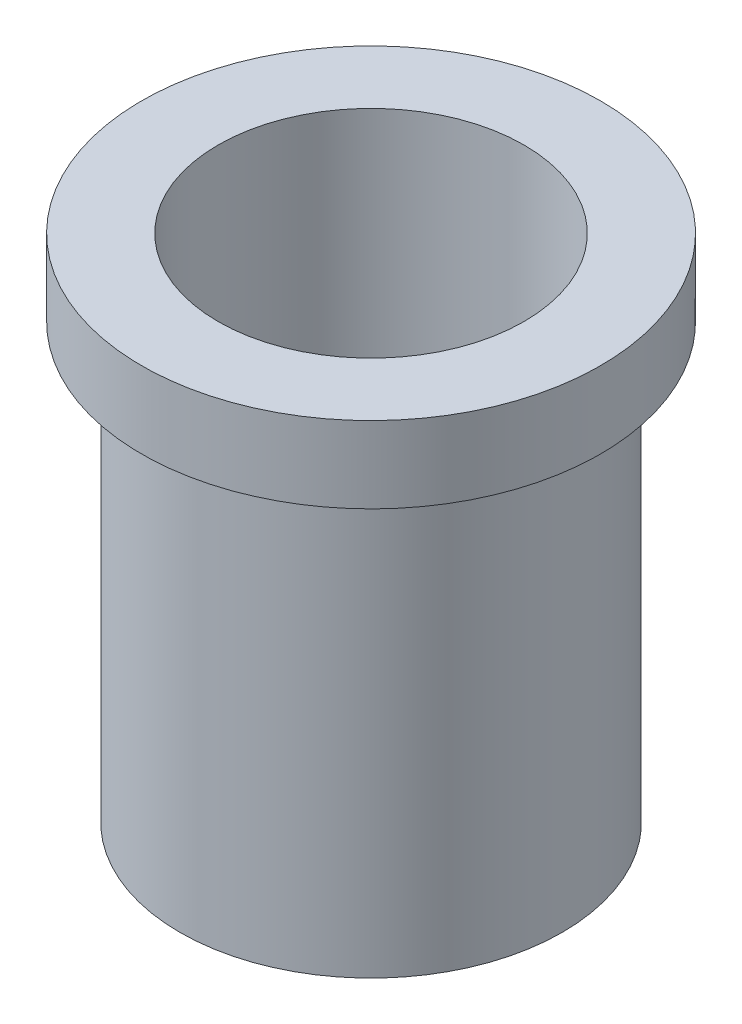
ISO-10303-21;
HEADER;
FILE_DESCRIPTION(('STEP AP214'),'2;1');
FILE_NAME('part.step','',(''),(''),'','','');
FILE_SCHEMA(('AUTOMOTIVE_DESIGN { 1 0 10303 214 1 1 1 1 }'));
ENDSEC;
DATA;
#1=APPLICATION_CONTEXT('core data for automotive mechanical design processes');
#2=APPLICATION_PROTOCOL_DEFINITION('international standard','automotive_design',2000,#1);
#3=PRODUCT_CONTEXT('',#1,'mechanical');
#4=PRODUCT('Part','Part','',(#3));
#5=PRODUCT_RELATED_PRODUCT_CATEGORY('part','',(#4));
#6=PRODUCT_DEFINITION_FORMATION('','',#4);
#7=PRODUCT_DEFINITION_CONTEXT('part definition',#1,'design');
#8=PRODUCT_DEFINITION('design','',#6,#7);
#9=PRODUCT_DEFINITION_SHAPE('','',#8);
#10=(LENGTH_UNIT() NAMED_UNIT(*) SI_UNIT(.MILLI.,.METRE.));
#11=(NAMED_UNIT(*) PLANE_ANGLE_UNIT() SI_UNIT($,.RADIAN.));
#12=(NAMED_UNIT(*) SI_UNIT($,.STERADIAN.) SOLID_ANGLE_UNIT());
#13=UNCERTAINTY_MEASURE_WITH_UNIT(LENGTH_MEASURE(1.E-05),#10,'distance_accuracy_value','');
#14=(GEOMETRIC_REPRESENTATION_CONTEXT(3) GLOBAL_UNCERTAINTY_ASSIGNED_CONTEXT((#13)) GLOBAL_UNIT_ASSIGNED_CONTEXT((#10,
#11,#12)) REPRESENTATION_CONTEXT('',''));
#15=CARTESIAN_POINT('',(0.,0.,0.));
#16=DIRECTION('',(0.,0.,1.));
#17=DIRECTION('',(1.,0.,0.));
#18=AXIS2_PLACEMENT_3D('',#15,#16,#17);
#19=CARTESIAN_POINT('',(49.,-12.,-49.));
#20=DIRECTION('',(0.,-1.,0.));
#21=DIRECTION('',(0.,0.,-1.));
#22=AXIS2_PLACEMENT_3D('',#19,#20,#21);
#23=PLANE('',#22);
#24=CARTESIAN_POINT('',(49.,-12.,-49.));
#25=DIRECTION('',(0.,-1.,0.));
#26=DIRECTION('',(0.,0.,-1.));
#27=AXIS2_PLACEMENT_3D('',#24,#25,#26);
#28=CIRCLE('',#27,9.);
#29=CARTESIAN_POINT('',(49.,-12.,-58.));
#30=VERTEX_POINT('',#29);
#31=EDGE_CURVE('E10',#30,#30,#28,.T.);
#32=ORIENTED_EDGE('',*,*,#31,.T.);
#33=EDGE_LOOP('',(#32));
#34=FACE_BOUND('',#33,.T.);
#35=CARTESIAN_POINT('',(49.,-12.,-49.));
#36=DIRECTION('',(0.,-1.,0.));
#37=DIRECTION('',(0.,0.,-1.));
#38=AXIS2_PLACEMENT_3D('',#35,#36,#37);
#39=CIRCLE('',#38,7.5);
#40=CARTESIAN_POINT('',(49.,-12.,-56.5));
#41=VERTEX_POINT('',#40);
#42=EDGE_CURVE('E48',#41,#41,#39,.T.);
#43=ORIENTED_EDGE('',*,*,#42,.F.);
#44=EDGE_LOOP('',(#43));
#45=FACE_BOUND('',#44,.T.);
#46=ADVANCED_FACE('F32',(#34,#45),#23,.T.);
#47=CARTESIAN_POINT('',(49.,-9.,-49.));
#48=DIRECTION('',(0.,-1.,0.));
#49=DIRECTION('',(0.,0.,-1.));
#50=AXIS2_PLACEMENT_3D('',#47,#48,#49);
#51=PLANE('',#50);
#52=CARTESIAN_POINT('',(49.,-9.,-49.));
#53=DIRECTION('',(0.,-1.,0.));
#54=DIRECTION('',(0.,0.,-1.));
#55=AXIS2_PLACEMENT_3D('',#52,#53,#54);
#56=CIRCLE('',#55,9.);
#57=CARTESIAN_POINT('',(49.,-9.,-58.));
#58=VERTEX_POINT('',#57);
#59=EDGE_CURVE('E36',#58,#58,#56,.T.);
#60=ORIENTED_EDGE('',*,*,#59,.F.);
#61=EDGE_LOOP('',(#60));
#62=FACE_BOUND('',#61,.T.);
#63=CARTESIAN_POINT('',(49.,-9.,-49.));
#64=DIRECTION('',(0.,-1.,0.));
#65=DIRECTION('',(0.,0.,-1.));
#66=AXIS2_PLACEMENT_3D('',#63,#64,#65);
#67=CIRCLE('',#66,6.);
#68=CARTESIAN_POINT('',(49.,-9.,-55.));
#69=VERTEX_POINT('',#68);
#70=EDGE_CURVE('E43',#69,#69,#67,.T.);
#71=ORIENTED_EDGE('',*,*,#70,.T.);
#72=EDGE_LOOP('',(#71));
#73=FACE_BOUND('',#72,.T.);
#74=ADVANCED_FACE('F73',(#62,#73),#51,.F.);
#75=CARTESIAN_POINT('',(49.,-12.,-49.));
#76=DIRECTION('',(0.,1.,0.));
#77=DIRECTION('',(0.,0.,1.));
#78=AXIS2_PLACEMENT_3D('',#75,#76,#77);
#79=CYLINDRICAL_SURFACE('',#78,9.);
#80=ORIENTED_EDGE('',*,*,#31,.F.);
#81=EDGE_LOOP('',(#80));
#82=FACE_BOUND('',#81,.T.);
#83=ORIENTED_EDGE('',*,*,#59,.T.);
#84=EDGE_LOOP('',(#83));
#85=FACE_BOUND('',#84,.T.);
#86=ADVANCED_FACE('F34',(#82,#85),#79,.T.);
#87=CARTESIAN_POINT('',(49.,-12.,-49.));
#88=DIRECTION('',(0.,1.,0.));
#89=DIRECTION('',(0.,0.,1.));
#90=AXIS2_PLACEMENT_3D('',#87,#88,#89);
#91=CYLINDRICAL_SURFACE('',#90,6.);
#92=ORIENTED_EDGE('',*,*,#70,.F.);
#93=EDGE_LOOP('',(#92));
#94=FACE_BOUND('',#93,.T.);
#95=CARTESIAN_POINT('',(49.,-29.,-49.));
#96=DIRECTION('',(0.,-1.,0.));
#97=DIRECTION('',(0.,0.,-1.));
#98=AXIS2_PLACEMENT_3D('',#95,#96,#97);
#99=CIRCLE('',#98,6.);
#100=CARTESIAN_POINT('',(49.,-29.,-55.));
#101=VERTEX_POINT('',#100);
#102=EDGE_CURVE('E51',#101,#101,#99,.T.);
#103=ORIENTED_EDGE('',*,*,#102,.T.);
#104=EDGE_LOOP('',(#103));
#105=FACE_BOUND('',#104,.T.);
#106=ADVANCED_FACE('F57',(#94,#105),#91,.F.);
#107=CARTESIAN_POINT('',(49.,-29.,-49.));
#108=DIRECTION('',(0.,-1.,0.));
#109=DIRECTION('',(0.,0.,-1.));
#110=AXIS2_PLACEMENT_3D('',#107,#108,#109);
#111=PLANE('',#110);
#112=CARTESIAN_POINT('',(49.,-29.,-49.));
#113=DIRECTION('',(0.,-1.,0.));
#114=DIRECTION('',(0.,0.,-1.));
#115=AXIS2_PLACEMENT_3D('',#112,#113,#114);
#116=CIRCLE('',#115,7.5);
#117=CARTESIAN_POINT('',(49.,-29.,-56.5));
#118=VERTEX_POINT('',#117);
#119=EDGE_CURVE('E47',#118,#118,#116,.T.);
#120=ORIENTED_EDGE('',*,*,#119,.T.);
#121=EDGE_LOOP('',(#120));
#122=FACE_BOUND('',#121,.T.);
#123=ORIENTED_EDGE('',*,*,#102,.F.);
#124=EDGE_LOOP('',(#123));
#125=FACE_BOUND('',#124,.T.);
#126=ADVANCED_FACE('F59',(#122,#125),#111,.T.);
#127=CARTESIAN_POINT('',(49.,-29.,-49.));
#128=DIRECTION('',(0.,1.,0.));
#129=DIRECTION('',(0.,0.,1.));
#130=AXIS2_PLACEMENT_3D('',#127,#128,#129);
#131=CYLINDRICAL_SURFACE('',#130,7.5);
#132=ORIENTED_EDGE('',*,*,#119,.F.);
#133=EDGE_LOOP('',(#132));
#134=FACE_BOUND('',#133,.T.);
#135=ORIENTED_EDGE('',*,*,#42,.T.);
#136=EDGE_LOOP('',(#135));
#137=FACE_BOUND('',#136,.T.);
#138=ADVANCED_FACE('F61',(#134,#137),#131,.T.);
#139=CLOSED_SHELL('',(#46,#74,#86,#106,#126,#138));
#140=MANIFOLD_SOLID_BREP('B2',#139);
#141=ADVANCED_BREP_SHAPE_REPRESENTATION('',(#18,#140),#14);
#142=SHAPE_DEFINITION_REPRESENTATION(#9,#141);
ENDSEC;
END-ISO-10303-21;
